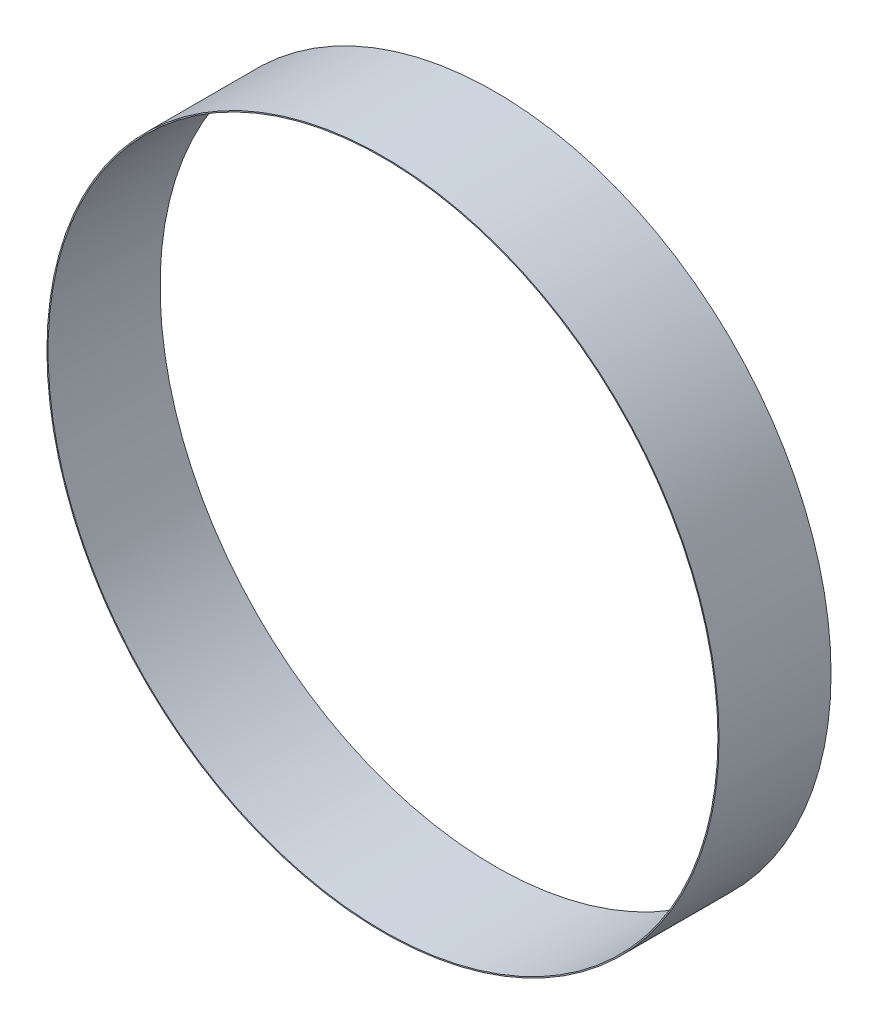
ISO-10303-21;
HEADER;
FILE_DESCRIPTION(('STEP AP214'),'2;1');
FILE_NAME('part.step','',(''),(''),'','','');
FILE_SCHEMA(('AUTOMOTIVE_DESIGN { 1 0 10303 214 1 1 1 1 }'));
ENDSEC;
DATA;
#1=APPLICATION_CONTEXT('core data for automotive mechanical design processes');
#2=APPLICATION_PROTOCOL_DEFINITION('international standard','automotive_design',2000,#1);
#3=PRODUCT_CONTEXT('',#1,'mechanical');
#4=PRODUCT('Part','Part','',(#3));
#5=PRODUCT_RELATED_PRODUCT_CATEGORY('part','',(#4));
#6=PRODUCT_DEFINITION_FORMATION('','',#4);
#7=PRODUCT_DEFINITION_CONTEXT('part definition',#1,'design');
#8=PRODUCT_DEFINITION('design','',#6,#7);
#9=PRODUCT_DEFINITION_SHAPE('','',#8);
#10=(LENGTH_UNIT() NAMED_UNIT(*) SI_UNIT(.MILLI.,.METRE.));
#11=(NAMED_UNIT(*) PLANE_ANGLE_UNIT() SI_UNIT($,.RADIAN.));
#12=(NAMED_UNIT(*) SI_UNIT($,.STERADIAN.) SOLID_ANGLE_UNIT());
#13=UNCERTAINTY_MEASURE_WITH_UNIT(LENGTH_MEASURE(1.E-05),#10,'distance_accuracy_value','');
#14=(GEOMETRIC_REPRESENTATION_CONTEXT(3) GLOBAL_UNCERTAINTY_ASSIGNED_CONTEXT((#13)) GLOBAL_UNIT_ASSIGNED_CONTEXT((#10,
#11,#12)) REPRESENTATION_CONTEXT('',''));
#15=CARTESIAN_POINT('',(0.,0.,0.));
#16=DIRECTION('',(0.,0.,1.));
#17=DIRECTION('',(1.,0.,0.));
#18=AXIS2_PLACEMENT_3D('',#15,#16,#17);
#19=CARTESIAN_POINT('',(0.,0.,500.));
#20=DIRECTION('',(0.,0.,1.));
#21=DIRECTION('',(1.,0.,0.));
#22=AXIS2_PLACEMENT_3D('',#19,#20,#21);
#23=PLANE('',#22);
#24=CARTESIAN_POINT('',(0.,0.,500.));
#25=DIRECTION('',(0.,0.,1.));
#26=DIRECTION('',(1.,0.,0.));
#27=AXIS2_PLACEMENT_3D('',#24,#25,#26);
#28=CIRCLE('',#27,1500.);
#29=CARTESIAN_POINT('',(1500.,0.,500.));
#30=VERTEX_POINT('',#29);
#31=EDGE_CURVE('E10',#30,#30,#28,.T.);
#32=ORIENTED_EDGE('',*,*,#31,.T.);
#33=EDGE_LOOP('',(#32));
#34=FACE_BOUND('',#33,.T.);
#35=CARTESIAN_POINT('',(0.,0.,500.));
#36=DIRECTION('',(0.,0.,1.));
#37=DIRECTION('',(1.,0.,0.));
#38=AXIS2_PLACEMENT_3D('',#35,#36,#37);
#39=CIRCLE('',#38,1495.);
#40=CARTESIAN_POINT('',(1495.,0.,500.));
#41=VERTEX_POINT('',#40);
#42=EDGE_CURVE('E50',#41,#41,#39,.T.);
#43=ORIENTED_EDGE('',*,*,#42,.F.);
#44=EDGE_LOOP('',(#43));
#45=FACE_BOUND('',#44,.T.);
#46=ADVANCED_FACE('F37',(#34,#45),#23,.T.);
#47=CARTESIAN_POINT('',(0.,0.,0.));
#48=DIRECTION('',(0.,0.,1.));
#49=DIRECTION('',(1.,0.,0.));
#50=AXIS2_PLACEMENT_3D('',#47,#48,#49);
#51=PLANE('',#50);
#52=CARTESIAN_POINT('',(0.,0.,0.));
#53=DIRECTION('',(0.,0.,1.));
#54=DIRECTION('',(1.,0.,0.));
#55=AXIS2_PLACEMENT_3D('',#52,#53,#54);
#56=CIRCLE('',#55,1500.);
#57=CARTESIAN_POINT('',(1500.,0.,0.));
#58=VERTEX_POINT('',#57);
#59=EDGE_CURVE('E41',#58,#58,#56,.T.);
#60=ORIENTED_EDGE('',*,*,#59,.F.);
#61=EDGE_LOOP('',(#60));
#62=FACE_BOUND('',#61,.T.);
#63=CARTESIAN_POINT('',(0.,0.,0.));
#64=DIRECTION('',(0.,0.,1.));
#65=DIRECTION('',(1.,0.,0.));
#66=AXIS2_PLACEMENT_3D('',#63,#64,#65);
#67=CIRCLE('',#66,1495.);
#68=CARTESIAN_POINT('',(1495.,0.,0.));
#69=VERTEX_POINT('',#68);
#70=EDGE_CURVE('E52',#69,#69,#67,.T.);
#71=ORIENTED_EDGE('',*,*,#70,.T.);
#72=EDGE_LOOP('',(#71));
#73=FACE_BOUND('',#72,.T.);
#74=ADVANCED_FACE('F64',(#62,#73),#51,.F.);
#75=CARTESIAN_POINT('',(0.,0.,500.));
#76=DIRECTION('',(0.,0.,-1.));
#77=DIRECTION('',(-1.,0.,0.));
#78=AXIS2_PLACEMENT_3D('',#75,#76,#77);
#79=CYLINDRICAL_SURFACE('',#78,1500.);
#80=ORIENTED_EDGE('',*,*,#31,.F.);
#81=EDGE_LOOP('',(#80));
#82=FACE_BOUND('',#81,.T.);
#83=ORIENTED_EDGE('',*,*,#59,.T.);
#84=EDGE_LOOP('',(#83));
#85=FACE_BOUND('',#84,.T.);
#86=ADVANCED_FACE('F39',(#82,#85),#79,.T.);
#87=CARTESIAN_POINT('',(0.,0.,500.));
#88=DIRECTION('',(0.,0.,-1.));
#89=DIRECTION('',(-1.,0.,0.));
#90=AXIS2_PLACEMENT_3D('',#87,#88,#89);
#91=CYLINDRICAL_SURFACE('',#90,1495.);
#92=ORIENTED_EDGE('',*,*,#42,.T.);
#93=EDGE_LOOP('',(#92));
#94=FACE_BOUND('',#93,.T.);
#95=ORIENTED_EDGE('',*,*,#70,.F.);
#96=EDGE_LOOP('',(#95));
#97=FACE_BOUND('',#96,.T.);
#98=ADVANCED_FACE('F60',(#94,#97),#91,.F.);
#99=CLOSED_SHELL('',(#46,#74,#86,#98));
#100=MANIFOLD_SOLID_BREP('B2',#99);
#101=ADVANCED_BREP_SHAPE_REPRESENTATION('',(#18,#100),#14);
#102=SHAPE_DEFINITION_REPRESENTATION(#9,#101);
ENDSEC;
END-ISO-10303-21;
